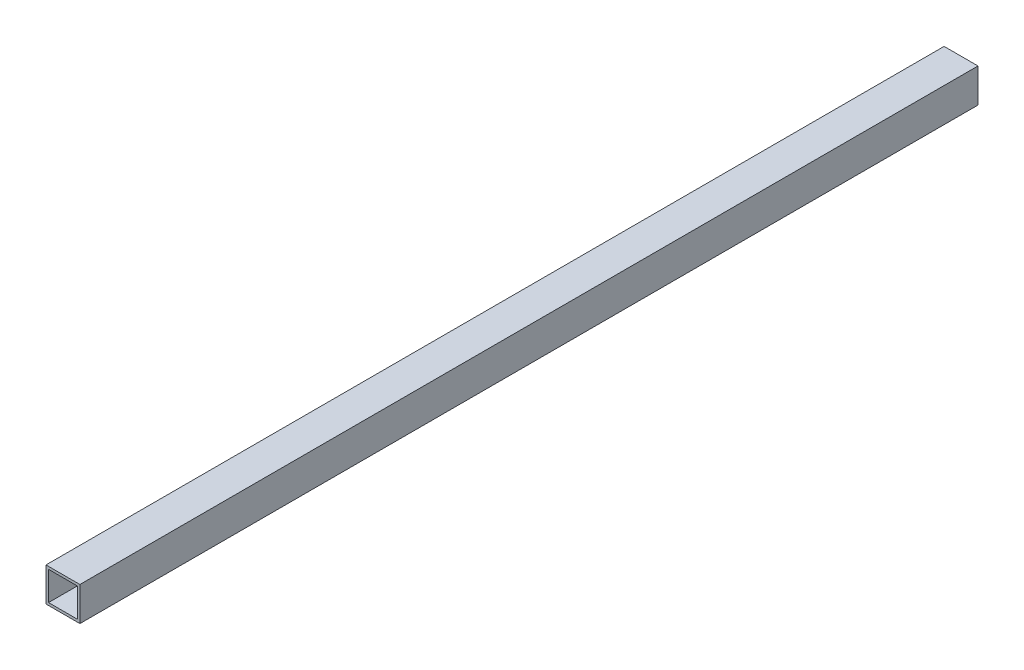
ISO-10303-21;
HEADER;
FILE_DESCRIPTION(('STEP AP214'),'2;1');
FILE_NAME('part.step','',(''),(''),'','','');
FILE_SCHEMA(('AUTOMOTIVE_DESIGN { 1 0 10303 214 1 1 1 1 }'));
ENDSEC;
DATA;
#1=APPLICATION_CONTEXT('core data for automotive mechanical design processes');
#2=APPLICATION_PROTOCOL_DEFINITION('international standard','automotive_design',2000,#1);
#3=PRODUCT_CONTEXT('',#1,'mechanical');
#4=PRODUCT('Part','Part','',(#3));
#5=PRODUCT_RELATED_PRODUCT_CATEGORY('part','',(#4));
#6=PRODUCT_DEFINITION_FORMATION('','',#4);
#7=PRODUCT_DEFINITION_CONTEXT('part definition',#1,'design');
#8=PRODUCT_DEFINITION('design','',#6,#7);
#9=PRODUCT_DEFINITION_SHAPE('','',#8);
#10=(LENGTH_UNIT() NAMED_UNIT(*) SI_UNIT(.MILLI.,.METRE.));
#11=(NAMED_UNIT(*) PLANE_ANGLE_UNIT() SI_UNIT($,.RADIAN.));
#12=(NAMED_UNIT(*) SI_UNIT($,.STERADIAN.) SOLID_ANGLE_UNIT());
#13=UNCERTAINTY_MEASURE_WITH_UNIT(LENGTH_MEASURE(1.E-05),#10,'distance_accuracy_value','');
#14=(GEOMETRIC_REPRESENTATION_CONTEXT(3) GLOBAL_UNCERTAINTY_ASSIGNED_CONTEXT((#13)) GLOBAL_UNIT_ASSIGNED_CONTEXT((#10,
#11,#12)) REPRESENTATION_CONTEXT('',''));
#15=CARTESIAN_POINT('',(0.,0.,0.));
#16=DIRECTION('',(0.,0.,1.));
#17=DIRECTION('',(1.,0.,0.));
#18=AXIS2_PLACEMENT_3D('',#15,#16,#17);
#19=CARTESIAN_POINT('',(0.,0.,530.));
#20=DIRECTION('',(0.,0.,1.));
#21=DIRECTION('',(1.,0.,0.));
#22=AXIS2_PLACEMENT_3D('',#19,#20,#21);
#23=PLANE('',#22);
#24=DIRECTION('',(0.,1.,0.));
#25=VECTOR('',#24,1.);
#26=CARTESIAN_POINT('',(10.,10.,530.));
#27=LINE('',#26,#25);
#28=CARTESIAN_POINT('',(10.,-10.,530.));
#29=VERTEX_POINT('',#28);
#30=CARTESIAN_POINT('',(10.,10.,530.));
#31=VERTEX_POINT('',#30);
#32=EDGE_CURVE('E159',#29,#31,#27,.T.);
#33=ORIENTED_EDGE('',*,*,#32,.T.);
#34=DIRECTION('',(-1.,0.,0.));
#35=VECTOR('',#34,1.);
#36=CARTESIAN_POINT('',(-10.,10.,530.));
#37=LINE('',#36,#35);
#38=CARTESIAN_POINT('',(-10.,10.,530.));
#39=VERTEX_POINT('',#38);
#40=EDGE_CURVE('E163',#31,#39,#37,.T.);
#41=ORIENTED_EDGE('',*,*,#40,.T.);
#42=DIRECTION('',(0.,-1.,0.));
#43=VECTOR('',#42,1.);
#44=CARTESIAN_POINT('',(-10.,10.,530.));
#45=LINE('',#44,#43);
#46=CARTESIAN_POINT('',(-10.,-10.,530.));
#47=VERTEX_POINT('',#46);
#48=EDGE_CURVE('E167',#39,#47,#45,.T.);
#49=ORIENTED_EDGE('',*,*,#48,.T.);
#50=DIRECTION('',(1.,0.,0.));
#51=VECTOR('',#50,1.);
#52=CARTESIAN_POINT('',(-10.,-10.,530.));
#53=LINE('',#52,#51);
#54=EDGE_CURVE('E170',#47,#29,#53,.T.);
#55=ORIENTED_EDGE('',*,*,#54,.T.);
#56=EDGE_LOOP('',(#33,#41,#49,#55));
#57=FACE_BOUND('',#56,.T.);
#58=DIRECTION('',(0.,-1.,0.));
#59=VECTOR('',#58,1.);
#60=CARTESIAN_POINT('',(-8.5,8.5,530.));
#61=LINE('',#60,#59);
#62=CARTESIAN_POINT('',(-8.5,8.5,530.));
#63=VERTEX_POINT('',#62);
#64=CARTESIAN_POINT('',(-8.5,-8.5,530.));
#65=VERTEX_POINT('',#64);
#66=EDGE_CURVE('E120',#63,#65,#61,.T.);
#67=ORIENTED_EDGE('',*,*,#66,.F.);
#68=DIRECTION('',(-1.,0.,0.));
#69=VECTOR('',#68,1.);
#70=CARTESIAN_POINT('',(-8.5,8.5,530.));
#71=LINE('',#70,#69);
#72=CARTESIAN_POINT('',(8.5,8.5,530.));
#73=VERTEX_POINT('',#72);
#74=EDGE_CURVE('E111',#73,#63,#71,.T.);
#75=ORIENTED_EDGE('',*,*,#74,.F.);
#76=DIRECTION('',(0.,1.,0.));
#77=VECTOR('',#76,1.);
#78=CARTESIAN_POINT('',(8.5,8.5,530.));
#79=LINE('',#78,#77);
#80=CARTESIAN_POINT('',(8.5,-8.50000000000001,530.));
#81=VERTEX_POINT('',#80);
#82=EDGE_CURVE('E137',#81,#73,#79,.T.);
#83=ORIENTED_EDGE('',*,*,#82,.F.);
#84=DIRECTION('',(1.,0.,0.));
#85=VECTOR('',#84,1.);
#86=CARTESIAN_POINT('',(-8.5,-8.5,530.));
#87=LINE('',#86,#85);
#88=EDGE_CURVE('E133',#65,#81,#87,.T.);
#89=ORIENTED_EDGE('',*,*,#88,.F.);
#90=EDGE_LOOP('',(#67,#75,#83,#89));
#91=FACE_BOUND('',#90,.T.);
#92=ADVANCED_FACE('F45',(#57,#91),#23,.T.);
#93=CARTESIAN_POINT('',(0.,0.,0.));
#94=DIRECTION('',(0.,0.,1.));
#95=DIRECTION('',(1.,0.,0.));
#96=AXIS2_PLACEMENT_3D('',#93,#94,#95);
#97=PLANE('',#96);
#98=DIRECTION('',(0.,1.,0.));
#99=VECTOR('',#98,1.);
#100=CARTESIAN_POINT('',(10.,10.,0.));
#101=LINE('',#100,#99);
#102=CARTESIAN_POINT('',(10.,-10.,0.));
#103=VERTEX_POINT('',#102);
#104=CARTESIAN_POINT('',(10.,10.,0.));
#105=VERTEX_POINT('',#104);
#106=EDGE_CURVE('E129',#103,#105,#101,.T.);
#107=ORIENTED_EDGE('',*,*,#106,.F.);
#108=DIRECTION('',(1.,0.,0.));
#109=VECTOR('',#108,1.);
#110=CARTESIAN_POINT('',(-10.,-10.,0.));
#111=LINE('',#110,#109);
#112=CARTESIAN_POINT('',(-10.,-10.,0.));
#113=VERTEX_POINT('',#112);
#114=EDGE_CURVE('E164',#113,#103,#111,.T.);
#115=ORIENTED_EDGE('',*,*,#114,.F.);
#116=DIRECTION('',(0.,-1.,0.));
#117=VECTOR('',#116,1.);
#118=CARTESIAN_POINT('',(-10.,10.,0.));
#119=LINE('',#118,#117);
#120=CARTESIAN_POINT('',(-10.,10.,0.));
#121=VERTEX_POINT('',#120);
#122=EDGE_CURVE('E180',#121,#113,#119,.T.);
#123=ORIENTED_EDGE('',*,*,#122,.F.);
#124=DIRECTION('',(-1.,0.,0.));
#125=VECTOR('',#124,1.);
#126=CARTESIAN_POINT('',(-10.,10.,0.));
#127=LINE('',#126,#125);
#128=EDGE_CURVE('E177',#105,#121,#127,.T.);
#129=ORIENTED_EDGE('',*,*,#128,.F.);
#130=EDGE_LOOP('',(#107,#115,#123,#129));
#131=FACE_BOUND('',#130,.T.);
#132=DIRECTION('',(-1.,0.,0.));
#133=VECTOR('',#132,1.);
#134=CARTESIAN_POINT('',(-8.5,8.5,0.));
#135=LINE('',#134,#133);
#136=CARTESIAN_POINT('',(8.5,8.5,0.));
#137=VERTEX_POINT('',#136);
#138=CARTESIAN_POINT('',(-8.5,8.5,0.));
#139=VERTEX_POINT('',#138);
#140=EDGE_CURVE('E69',#137,#139,#135,.T.);
#141=ORIENTED_EDGE('',*,*,#140,.T.);
#142=DIRECTION('',(0.,-1.,0.));
#143=VECTOR('',#142,1.);
#144=CARTESIAN_POINT('',(-8.5,8.5,0.));
#145=LINE('',#144,#143);
#146=CARTESIAN_POINT('',(-8.5,-8.5,0.));
#147=VERTEX_POINT('',#146);
#148=EDGE_CURVE('E127',#139,#147,#145,.T.);
#149=ORIENTED_EDGE('',*,*,#148,.T.);
#150=DIRECTION('',(1.,0.,0.));
#151=VECTOR('',#150,1.);
#152=CARTESIAN_POINT('',(-8.5,-8.5,0.));
#153=LINE('',#152,#151);
#154=CARTESIAN_POINT('',(8.5,-8.50000000000001,0.));
#155=VERTEX_POINT('',#154);
#156=EDGE_CURVE('E146',#147,#155,#153,.T.);
#157=ORIENTED_EDGE('',*,*,#156,.T.);
#158=DIRECTION('',(0.,1.,0.));
#159=VECTOR('',#158,1.);
#160=CARTESIAN_POINT('',(8.5,8.5,0.));
#161=LINE('',#160,#159);
#162=EDGE_CURVE('E121',#155,#137,#161,.T.);
#163=ORIENTED_EDGE('',*,*,#162,.T.);
#164=EDGE_LOOP('',(#141,#149,#157,#163));
#165=FACE_BOUND('',#164,.T.);
#166=ADVANCED_FACE('F203',(#131,#165),#97,.F.);
#167=CARTESIAN_POINT('',(10.,10.,530.));
#168=DIRECTION('',(-1.,0.,0.));
#169=DIRECTION('',(0.,-1.,0.));
#170=AXIS2_PLACEMENT_3D('',#167,#168,#169);
#171=PLANE('',#170);
#172=ORIENTED_EDGE('',*,*,#106,.T.);
#173=DIRECTION('',(0.,0.,-1.));
#174=VECTOR('',#173,1.);
#175=CARTESIAN_POINT('',(10.,10.,530.));
#176=LINE('',#175,#174);
#177=EDGE_CURVE('E11',#31,#105,#176,.T.);
#178=ORIENTED_EDGE('',*,*,#177,.F.);
#179=ORIENTED_EDGE('',*,*,#32,.F.);
#180=DIRECTION('',(0.,0.,-1.));
#181=VECTOR('',#180,1.);
#182=CARTESIAN_POINT('',(10.,-10.,530.));
#183=LINE('',#182,#181);
#184=EDGE_CURVE('E173',#29,#103,#183,.T.);
#185=ORIENTED_EDGE('',*,*,#184,.T.);
#186=EDGE_LOOP('',(#172,#178,#179,#185));
#187=FACE_BOUND('',#186,.T.);
#188=ADVANCED_FACE('F47',(#187),#171,.F.);
#189=CARTESIAN_POINT('',(-10.,10.,530.));
#190=DIRECTION('',(0.,-1.,0.));
#191=DIRECTION('',(0.,0.,-1.));
#192=AXIS2_PLACEMENT_3D('',#189,#190,#191);
#193=PLANE('',#192);
#194=ORIENTED_EDGE('',*,*,#128,.T.);
#195=DIRECTION('',(0.,0.,-1.));
#196=VECTOR('',#195,1.);
#197=CARTESIAN_POINT('',(-10.,10.,530.));
#198=LINE('',#197,#196);
#199=EDGE_CURVE('E54',#39,#121,#198,.T.);
#200=ORIENTED_EDGE('',*,*,#199,.F.);
#201=ORIENTED_EDGE('',*,*,#40,.F.);
#202=ORIENTED_EDGE('',*,*,#177,.T.);
#203=EDGE_LOOP('',(#194,#200,#201,#202));
#204=FACE_BOUND('',#203,.T.);
#205=ADVANCED_FACE('F213',(#204),#193,.F.);
#206=CARTESIAN_POINT('',(-10.,10.,530.));
#207=DIRECTION('',(1.,0.,0.));
#208=DIRECTION('',(0.,1.,0.));
#209=AXIS2_PLACEMENT_3D('',#206,#207,#208);
#210=PLANE('',#209);
#211=ORIENTED_EDGE('',*,*,#122,.T.);
#212=DIRECTION('',(0.,0.,-1.));
#213=VECTOR('',#212,1.);
#214=CARTESIAN_POINT('',(-10.,-10.,530.));
#215=LINE('',#214,#213);
#216=EDGE_CURVE('E188',#47,#113,#215,.T.);
#217=ORIENTED_EDGE('',*,*,#216,.F.);
#218=ORIENTED_EDGE('',*,*,#48,.F.);
#219=ORIENTED_EDGE('',*,*,#199,.T.);
#220=EDGE_LOOP('',(#211,#217,#218,#219));
#221=FACE_BOUND('',#220,.T.);
#222=ADVANCED_FACE('F197',(#221),#210,.F.);
#223=CARTESIAN_POINT('',(-10.,-10.,530.));
#224=DIRECTION('',(0.,1.,0.));
#225=DIRECTION('',(0.,0.,1.));
#226=AXIS2_PLACEMENT_3D('',#223,#224,#225);
#227=PLANE('',#226);
#228=ORIENTED_EDGE('',*,*,#114,.T.);
#229=ORIENTED_EDGE('',*,*,#184,.F.);
#230=ORIENTED_EDGE('',*,*,#54,.F.);
#231=ORIENTED_EDGE('',*,*,#216,.T.);
#232=EDGE_LOOP('',(#228,#229,#230,#231));
#233=FACE_BOUND('',#232,.T.);
#234=ADVANCED_FACE('F207',(#233),#227,.F.);
#235=CARTESIAN_POINT('',(-8.5,8.5,530.));
#236=DIRECTION('',(0.,-1.,0.));
#237=DIRECTION('',(0.,0.,-1.));
#238=AXIS2_PLACEMENT_3D('',#235,#236,#237);
#239=PLANE('',#238);
#240=ORIENTED_EDGE('',*,*,#140,.F.);
#241=DIRECTION('',(0.,0.,-1.));
#242=VECTOR('',#241,1.);
#243=CARTESIAN_POINT('',(8.5,8.5,530.));
#244=LINE('',#243,#242);
#245=EDGE_CURVE('E115',#73,#137,#244,.T.);
#246=ORIENTED_EDGE('',*,*,#245,.F.);
#247=ORIENTED_EDGE('',*,*,#74,.T.);
#248=DIRECTION('',(0.,0.,-1.));
#249=VECTOR('',#248,1.);
#250=CARTESIAN_POINT('',(-8.5,8.5,530.));
#251=LINE('',#250,#249);
#252=EDGE_CURVE('E114',#63,#139,#251,.T.);
#253=ORIENTED_EDGE('',*,*,#252,.T.);
#254=EDGE_LOOP('',(#240,#246,#247,#253));
#255=FACE_BOUND('',#254,.T.);
#256=ADVANCED_FACE('F113',(#255),#239,.T.);
#257=CARTESIAN_POINT('',(-8.5,8.5,530.));
#258=DIRECTION('',(1.,0.,0.));
#259=DIRECTION('',(0.,1.,0.));
#260=AXIS2_PLACEMENT_3D('',#257,#258,#259);
#261=PLANE('',#260);
#262=ORIENTED_EDGE('',*,*,#148,.F.);
#263=ORIENTED_EDGE('',*,*,#252,.F.);
#264=ORIENTED_EDGE('',*,*,#66,.T.);
#265=DIRECTION('',(0.,0.,-1.));
#266=VECTOR('',#265,1.);
#267=CARTESIAN_POINT('',(-8.5,-8.5,530.));
#268=LINE('',#267,#266);
#269=EDGE_CURVE('E130',#65,#147,#268,.T.);
#270=ORIENTED_EDGE('',*,*,#269,.T.);
#271=EDGE_LOOP('',(#262,#263,#264,#270));
#272=FACE_BOUND('',#271,.T.);
#273=ADVANCED_FACE('F124',(#272),#261,.T.);
#274=CARTESIAN_POINT('',(-8.5,-8.5,530.));
#275=DIRECTION('',(0.,1.,0.));
#276=DIRECTION('',(-1.,0.,0.));
#277=AXIS2_PLACEMENT_3D('',#274,#275,#276);
#278=PLANE('',#277);
#279=ORIENTED_EDGE('',*,*,#156,.F.);
#280=ORIENTED_EDGE('',*,*,#269,.F.);
#281=ORIENTED_EDGE('',*,*,#88,.T.);
#282=DIRECTION('',(0.,0.,-1.));
#283=VECTOR('',#282,1.);
#284=CARTESIAN_POINT('',(8.5,-8.50000000000001,530.));
#285=LINE('',#284,#283);
#286=EDGE_CURVE('E61',#81,#155,#285,.T.);
#287=ORIENTED_EDGE('',*,*,#286,.T.);
#288=EDGE_LOOP('',(#279,#280,#281,#287));
#289=FACE_BOUND('',#288,.T.);
#290=ADVANCED_FACE('F236',(#289),#278,.T.);
#291=CARTESIAN_POINT('',(8.5,8.5,530.));
#292=DIRECTION('',(-1.,0.,0.));
#293=DIRECTION('',(0.,-1.,0.));
#294=AXIS2_PLACEMENT_3D('',#291,#292,#293);
#295=PLANE('',#294);
#296=ORIENTED_EDGE('',*,*,#162,.F.);
#297=ORIENTED_EDGE('',*,*,#286,.F.);
#298=ORIENTED_EDGE('',*,*,#82,.T.);
#299=ORIENTED_EDGE('',*,*,#245,.T.);
#300=EDGE_LOOP('',(#296,#297,#298,#299));
#301=FACE_BOUND('',#300,.T.);
#302=ADVANCED_FACE('F240',(#301),#295,.T.);
#303=CLOSED_SHELL('',(#92,#166,#188,#205,#222,#234,#256,#273,#290,#302));
#304=MANIFOLD_SOLID_BREP('B2',#303);
#305=ADVANCED_BREP_SHAPE_REPRESENTATION('',(#18,#304),#14);
#306=SHAPE_DEFINITION_REPRESENTATION(#9,#305);
ENDSEC;
END-ISO-10303-21;
